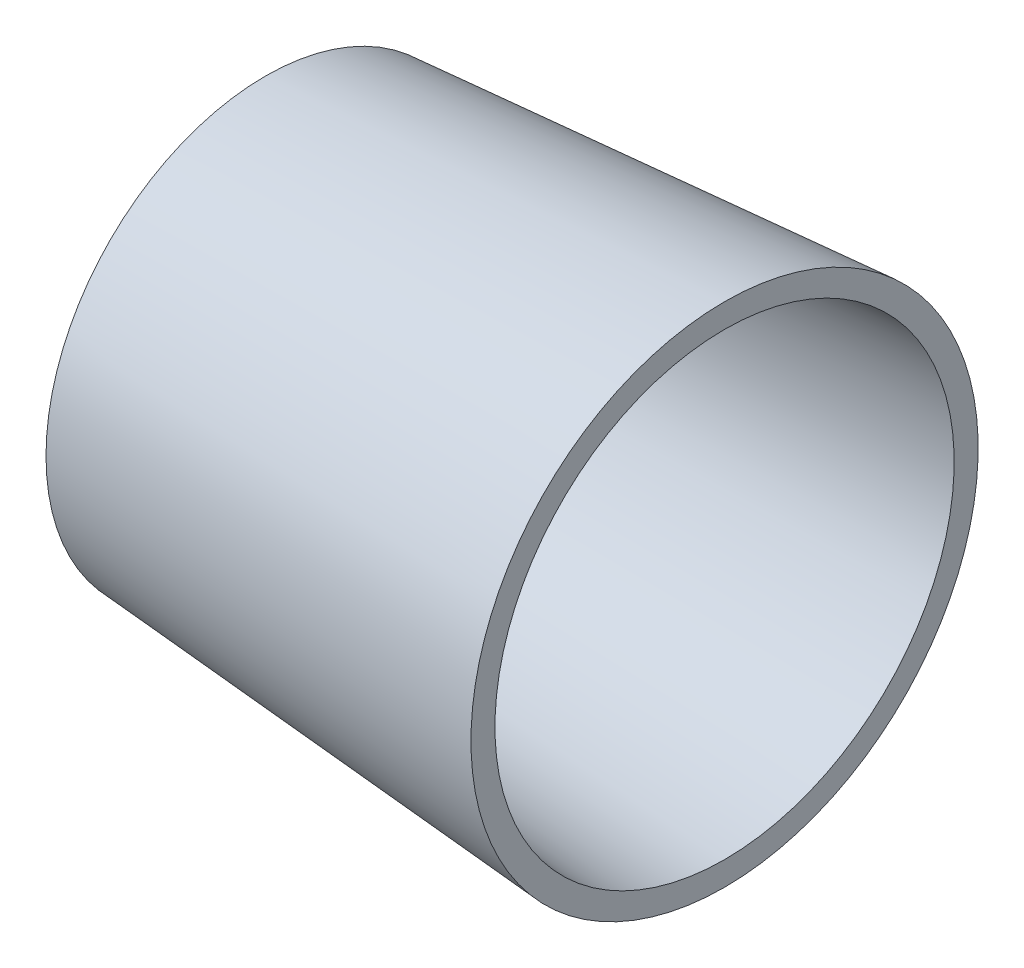
ISO-10303-21;
HEADER;
FILE_DESCRIPTION(('STEP AP214'),'2;1');
FILE_NAME('part.step','',(''),(''),'','','');
FILE_SCHEMA(('AUTOMOTIVE_DESIGN { 1 0 10303 214 1 1 1 1 }'));
ENDSEC;
DATA;
#1=APPLICATION_CONTEXT('core data for automotive mechanical design processes');
#2=APPLICATION_PROTOCOL_DEFINITION('international standard','automotive_design',2000,#1);
#3=PRODUCT_CONTEXT('',#1,'mechanical');
#4=PRODUCT('Part','Part','',(#3));
#5=PRODUCT_RELATED_PRODUCT_CATEGORY('part','',(#4));
#6=PRODUCT_DEFINITION_FORMATION('','',#4);
#7=PRODUCT_DEFINITION_CONTEXT('part definition',#1,'design');
#8=PRODUCT_DEFINITION('design','',#6,#7);
#9=PRODUCT_DEFINITION_SHAPE('','',#8);
#10=(LENGTH_UNIT() NAMED_UNIT(*) SI_UNIT(.MILLI.,.METRE.));
#11=(NAMED_UNIT(*) PLANE_ANGLE_UNIT() SI_UNIT($,.RADIAN.));
#12=(NAMED_UNIT(*) SI_UNIT($,.STERADIAN.) SOLID_ANGLE_UNIT());
#13=UNCERTAINTY_MEASURE_WITH_UNIT(LENGTH_MEASURE(1.E-05),#10,'distance_accuracy_value','');
#14=(GEOMETRIC_REPRESENTATION_CONTEXT(3) GLOBAL_UNCERTAINTY_ASSIGNED_CONTEXT((#13)) GLOBAL_UNIT_ASSIGNED_CONTEXT((#10,
#11,#12)) REPRESENTATION_CONTEXT('',''));
#15=CARTESIAN_POINT('',(0.,0.,0.));
#16=DIRECTION('',(0.,0.,1.));
#17=DIRECTION('',(1.,0.,0.));
#18=AXIS2_PLACEMENT_3D('',#15,#16,#17);
#19=CARTESIAN_POINT('',(4780.,0.,0.));
#20=DIRECTION('',(1.,0.,0.));
#21=DIRECTION('',(0.,0.,-1.));
#22=AXIS2_PLACEMENT_3D('',#19,#20,#21);
#23=CONICAL_SURFACE('',#22,580.,0.0670634584356692);
#24=CARTESIAN_POINT('',(4780.,0.,0.));
#25=DIRECTION('',(-1.,0.,0.));
#26=DIRECTION('',(0.,0.,1.));
#27=AXIS2_PLACEMENT_3D('',#24,#25,#26);
#28=CIRCLE('',#27,580.);
#29=CARTESIAN_POINT('',(4780.,580.,-4.16415991461627E-06));
#30=VERTEX_POINT('',#29);
#31=CARTESIAN_POINT('',(4780.,580.,0.));
#32=VERTEX_POINT('',#31);
#33=EDGE_CURVE('E11',#30,#32,#28,.T.);
#34=ORIENTED_EDGE('',*,*,#33,.T.);
#35=DIRECTION('',(0.997752088960537,0.0670132000048122,0.));
#36=VECTOR('',#35,1.);
#37=CARTESIAN_POINT('',(6120.,670.,0.));
#38=LINE('',#37,#36);
#39=CARTESIAN_POINT('',(6120.,670.,0.));
#40=VERTEX_POINT('',#39);
#41=EDGE_CURVE('E100',#32,#40,#38,.T.);
#42=ORIENTED_EDGE('',*,*,#41,.T.);
#43=CARTESIAN_POINT('',(6120.,0.,0.));
#44=DIRECTION('',(-1.,0.,0.));
#45=DIRECTION('',(0.,0.,1.));
#46=AXIS2_PLACEMENT_3D('',#43,#44,#45);
#47=CIRCLE('',#46,670.);
#48=CARTESIAN_POINT('',(6120.,670.,-4.81032265998776E-06));
#49=VERTEX_POINT('',#48);
#50=EDGE_CURVE('E80',#49,#40,#47,.T.);
#51=ORIENTED_EDGE('',*,*,#50,.F.);
#52=DIRECTION('',(0.997752088960537,0.0670132000048122,-4.81127036569314E-10));
#53=VECTOR('',#52,1.);
#54=CARTESIAN_POINT('',(6120.,670.,-4.81032265998776E-06));
#55=LINE('',#54,#53);
#56=EDGE_CURVE('E103',#30,#49,#55,.T.);
#57=ORIENTED_EDGE('',*,*,#56,.F.);
#58=EDGE_LOOP('',(#34,#42,#51,#57));
#59=FACE_BOUND('',#58,.T.);
#60=ADVANCED_FACE('F39',(#59),#23,.F.);
#61=CARTESIAN_POINT('',(4780.,580.,-4.16415991461627E-06));
#62=DIRECTION('',(1.,0.,0.));
#63=DIRECTION('',(0.,0.,-1.));
#64=AXIS2_PLACEMENT_3D('',#61,#62,#63);
#65=PLANE('',#64);
#66=CARTESIAN_POINT('',(4780.,0.,0.));
#67=DIRECTION('',(-1.,0.,0.));
#68=DIRECTION('',(0.,0.,1.));
#69=AXIS2_PLACEMENT_3D('',#66,#67,#68);
#70=CIRCLE('',#69,640.);
#71=CARTESIAN_POINT('',(4780.,640.,-4.59493507819726E-06));
#72=VERTEX_POINT('',#71);
#73=CARTESIAN_POINT('',(4780.,640.,0.));
#74=VERTEX_POINT('',#73);
#75=EDGE_CURVE('E50',#72,#74,#70,.T.);
#76=ORIENTED_EDGE('',*,*,#75,.T.);
#77=DIRECTION('',(0.,-1.,0.));
#78=VECTOR('',#77,1.);
#79=CARTESIAN_POINT('',(4780.,580.,0.));
#80=LINE('',#79,#78);
#81=EDGE_CURVE('E104',#74,#32,#80,.T.);
#82=ORIENTED_EDGE('',*,*,#81,.T.);
#83=ORIENTED_EDGE('',*,*,#33,.F.);
#84=DIRECTION('',(0.,-1.,7.17958605968322E-09));
#85=VECTOR('',#84,1.);
#86=CARTESIAN_POINT('',(4780.,580.,-4.16415991461627E-06));
#87=LINE('',#86,#85);
#88=EDGE_CURVE('E91',#72,#30,#87,.T.);
#89=ORIENTED_EDGE('',*,*,#88,.F.);
#90=EDGE_LOOP('',(#76,#82,#83,#89));
#91=FACE_BOUND('',#90,.T.);
#92=ADVANCED_FACE('F41',(#91),#65,.F.);
#93=CARTESIAN_POINT('',(6120.,0.,0.));
#94=DIRECTION('',(1.,0.,0.));
#95=DIRECTION('',(0.,0.,-1.));
#96=AXIS2_PLACEMENT_3D('',#93,#94,#95);
#97=CONICAL_SURFACE('',#96,740.,0.0744887902138817);
#98=CARTESIAN_POINT('',(6120.,0.,0.));
#99=DIRECTION('',(-1.,0.,0.));
#100=DIRECTION('',(0.,0.,1.));
#101=AXIS2_PLACEMENT_3D('',#98,#99,#100);
#102=CIRCLE('',#101,740.);
#103=CARTESIAN_POINT('',(6120.,740.,-5.31289368416559E-06));
#104=VERTEX_POINT('',#103);
#105=CARTESIAN_POINT('',(6120.,740.,0.));
#106=VERTEX_POINT('',#105);
#107=EDGE_CURVE('E89',#104,#106,#102,.T.);
#108=ORIENTED_EDGE('',*,*,#107,.T.);
#109=DIRECTION('',(-0.997226992609779,-0.0744199248216253,0.));
#110=VECTOR('',#109,1.);
#111=CARTESIAN_POINT('',(4780.,640.,0.));
#112=LINE('',#111,#110);
#113=EDGE_CURVE('E97',#106,#74,#112,.T.);
#114=ORIENTED_EDGE('',*,*,#113,.T.);
#115=ORIENTED_EDGE('',*,*,#75,.F.);
#116=DIRECTION('',(-0.997226992609779,-0.0744199248216253,5.34304254812014E-10));
#117=VECTOR('',#116,1.);
#118=CARTESIAN_POINT('',(4780.,640.,-4.59493507819726E-06));
#119=LINE('',#118,#117);
#120=EDGE_CURVE('E109',#104,#72,#119,.T.);
#121=ORIENTED_EDGE('',*,*,#120,.F.);
#122=EDGE_LOOP('',(#108,#114,#115,#121));
#123=FACE_BOUND('',#122,.T.);
#124=ADVANCED_FACE('F112',(#123),#97,.T.);
#125=CARTESIAN_POINT('',(6120.,740.,-5.31289368416559E-06));
#126=DIRECTION('',(-1.,0.,0.));
#127=DIRECTION('',(0.,0.,1.));
#128=AXIS2_PLACEMENT_3D('',#125,#126,#127);
#129=PLANE('',#128);
#130=DIRECTION('',(0.,1.,-7.17958605968322E-09));
#131=VECTOR('',#130,1.);
#132=CARTESIAN_POINT('',(6120.,740.,-5.31289368416559E-06));
#133=LINE('',#132,#131);
#134=EDGE_CURVE('E82',#49,#104,#133,.T.);
#135=ORIENTED_EDGE('',*,*,#134,.F.);
#136=ORIENTED_EDGE('',*,*,#50,.T.);
#137=DIRECTION('',(0.,1.,0.));
#138=VECTOR('',#137,1.);
#139=CARTESIAN_POINT('',(6120.,740.,0.));
#140=LINE('',#139,#138);
#141=EDGE_CURVE('E85',#40,#106,#140,.T.);
#142=ORIENTED_EDGE('',*,*,#141,.T.);
#143=ORIENTED_EDGE('',*,*,#107,.F.);
#144=EDGE_LOOP('',(#135,#136,#142,#143));
#145=FACE_BOUND('',#144,.T.);
#146=ADVANCED_FACE('F83',(#145),#129,.F.);
#147=CARTESIAN_POINT('',(0.,0.,0.));
#148=DIRECTION('',(0.,-7.17958605968322E-09,-1.));
#149=DIRECTION('',(-1.,0.,0.));
#150=AXIS2_PLACEMENT_3D('',#147,#148,#149);
#151=PLANE('',#150);
#152=ORIENTED_EDGE('',*,*,#56,.T.);
#153=ORIENTED_EDGE('',*,*,#134,.T.);
#154=ORIENTED_EDGE('',*,*,#120,.T.);
#155=ORIENTED_EDGE('',*,*,#88,.T.);
#156=EDGE_LOOP('',(#152,#153,#154,#155));
#157=FACE_BOUND('',#156,.T.);
#158=ADVANCED_FACE('F111',(#157),#151,.F.);
#159=CARTESIAN_POINT('',(0.,0.,0.));
#160=DIRECTION('',(0.,0.,-1.));
#161=DIRECTION('',(-1.,0.,0.));
#162=AXIS2_PLACEMENT_3D('',#159,#160,#161);
#163=PLANE('',#162);
#164=ORIENTED_EDGE('',*,*,#41,.F.);
#165=ORIENTED_EDGE('',*,*,#81,.F.);
#166=ORIENTED_EDGE('',*,*,#113,.F.);
#167=ORIENTED_EDGE('',*,*,#141,.F.);
#168=EDGE_LOOP('',(#164,#165,#166,#167));
#169=FACE_BOUND('',#168,.T.);
#170=ADVANCED_FACE('F94',(#169),#163,.T.);
#171=CLOSED_SHELL('',(#60,#92,#124,#146,#158,#170));
#172=MANIFOLD_SOLID_BREP('B2',#171);
#173=ADVANCED_BREP_SHAPE_REPRESENTATION('',(#18,#172),#14);
#174=SHAPE_DEFINITION_REPRESENTATION(#9,#173);
ENDSEC;
END-ISO-10303-21;
